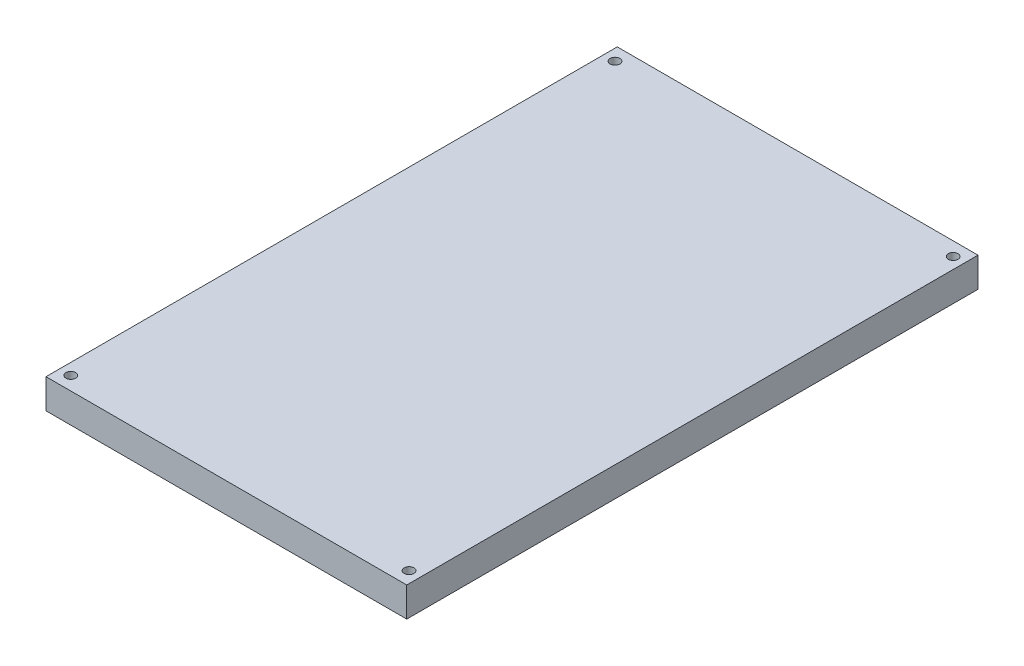
ISO-10303-21;
HEADER;
FILE_DESCRIPTION(('STEP AP214'),'2;1');
FILE_NAME('part.step','',(''),(''),'','','');
FILE_SCHEMA(('AUTOMOTIVE_DESIGN { 1 0 10303 214 1 1 1 1 }'));
ENDSEC;
DATA;
#1=APPLICATION_CONTEXT('core data for automotive mechanical design processes');
#2=APPLICATION_PROTOCOL_DEFINITION('international standard','automotive_design',2000,#1);
#3=PRODUCT_CONTEXT('',#1,'mechanical');
#4=PRODUCT('Part','Part','',(#3));
#5=PRODUCT_RELATED_PRODUCT_CATEGORY('part','',(#4));
#6=PRODUCT_DEFINITION_FORMATION('','',#4);
#7=PRODUCT_DEFINITION_CONTEXT('part definition',#1,'design');
#8=PRODUCT_DEFINITION('design','',#6,#7);
#9=PRODUCT_DEFINITION_SHAPE('','',#8);
#10=(LENGTH_UNIT() NAMED_UNIT(*) SI_UNIT(.MILLI.,.METRE.));
#11=(NAMED_UNIT(*) PLANE_ANGLE_UNIT() SI_UNIT($,.RADIAN.));
#12=(NAMED_UNIT(*) SI_UNIT($,.STERADIAN.) SOLID_ANGLE_UNIT());
#13=UNCERTAINTY_MEASURE_WITH_UNIT(LENGTH_MEASURE(1.E-05),#10,'distance_accuracy_value','');
#14=(GEOMETRIC_REPRESENTATION_CONTEXT(3) GLOBAL_UNCERTAINTY_ASSIGNED_CONTEXT((#13)) GLOBAL_UNIT_ASSIGNED_CONTEXT((#10,
#11,#12)) REPRESENTATION_CONTEXT('',''));
#15=CARTESIAN_POINT('',(0.,0.,0.));
#16=DIRECTION('',(0.,0.,1.));
#17=DIRECTION('',(1.,0.,0.));
#18=AXIS2_PLACEMENT_3D('',#15,#16,#17);
#19=CARTESIAN_POINT('',(0.,10.,0.));
#20=DIRECTION('',(0.,1.,0.));
#21=DIRECTION('',(0.,0.,1.));
#22=AXIS2_PLACEMENT_3D('',#19,#20,#21);
#23=PLANE('',#22);
#24=CARTESIAN_POINT('',(57.15,10.,-91.948));
#25=DIRECTION('',(0.,1.,0.));
#26=DIRECTION('',(0.,0.,1.));
#27=AXIS2_PLACEMENT_3D('',#24,#25,#26);
#28=CIRCLE('',#27,1.651);
#29=CARTESIAN_POINT('',(57.15,10.,-90.297));
#30=VERTEX_POINT('',#29);
#31=EDGE_CURVE('E124',#30,#30,#28,.T.);
#32=ORIENTED_EDGE('',*,*,#31,.F.);
#33=EDGE_LOOP('',(#32));
#34=FACE_BOUND('',#33,.T.);
#35=CARTESIAN_POINT('',(-57.15,10.,91.9607));
#36=DIRECTION('',(0.,1.,0.));
#37=DIRECTION('',(0.,0.,1.));
#38=AXIS2_PLACEMENT_3D('',#35,#36,#37);
#39=CIRCLE('',#38,1.651);
#40=CARTESIAN_POINT('',(-57.15,10.,93.6117));
#41=VERTEX_POINT('',#40);
#42=EDGE_CURVE('E103',#41,#41,#39,.T.);
#43=ORIENTED_EDGE('',*,*,#42,.F.);
#44=EDGE_LOOP('',(#43));
#45=FACE_BOUND('',#44,.T.);
#46=DIRECTION('',(0.,0.,1.));
#47=VECTOR('',#46,1.);
#48=CARTESIAN_POINT('',(-60.96,10.,96.5327));
#49=LINE('',#48,#47);
#50=CARTESIAN_POINT('',(-60.96,10.,-96.5327));
#51=VERTEX_POINT('',#50);
#52=CARTESIAN_POINT('',(-60.96,10.,96.5327));
#53=VERTEX_POINT('',#52);
#54=EDGE_CURVE('E88',#51,#53,#49,.T.);
#55=ORIENTED_EDGE('',*,*,#54,.T.);
#56=DIRECTION('',(1.,0.,0.));
#57=VECTOR('',#56,1.);
#58=CARTESIAN_POINT('',(60.96,10.,96.5327));
#59=LINE('',#58,#57);
#60=CARTESIAN_POINT('',(60.96,10.,96.5327));
#61=VERTEX_POINT('',#60);
#62=EDGE_CURVE('E83',#53,#61,#59,.T.);
#63=ORIENTED_EDGE('',*,*,#62,.T.);
#64=DIRECTION('',(0.,0.,-1.));
#65=VECTOR('',#64,1.);
#66=CARTESIAN_POINT('',(60.96,10.,96.5327));
#67=LINE('',#66,#65);
#68=CARTESIAN_POINT('',(60.96,10.,-96.5327));
#69=VERTEX_POINT('',#68);
#70=EDGE_CURVE('E86',#61,#69,#67,.T.);
#71=ORIENTED_EDGE('',*,*,#70,.T.);
#72=DIRECTION('',(-1.,0.,0.));
#73=VECTOR('',#72,1.);
#74=CARTESIAN_POINT('',(60.96,10.,-96.5327));
#75=LINE('',#74,#73);
#76=EDGE_CURVE('E53',#69,#51,#75,.T.);
#77=ORIENTED_EDGE('',*,*,#76,.T.);
#78=EDGE_LOOP('',(#55,#63,#71,#77));
#79=FACE_BOUND('',#78,.T.);
#80=CARTESIAN_POINT('',(57.15,10.,91.948));
#81=DIRECTION('',(0.,1.,0.));
#82=DIRECTION('',(0.,0.,-1.));
#83=AXIS2_PLACEMENT_3D('',#80,#81,#82);
#84=CIRCLE('',#83,1.651);
#85=CARTESIAN_POINT('',(57.15,10.,90.297));
#86=VERTEX_POINT('',#85);
#87=EDGE_CURVE('E118',#86,#86,#84,.T.);
#88=ORIENTED_EDGE('',*,*,#87,.F.);
#89=EDGE_LOOP('',(#88));
#90=FACE_BOUND('',#89,.T.);
#91=CARTESIAN_POINT('',(-57.15,10.,-91.948));
#92=DIRECTION('',(0.,1.,0.));
#93=DIRECTION('',(0.,0.,-1.));
#94=AXIS2_PLACEMENT_3D('',#91,#92,#93);
#95=CIRCLE('',#94,1.65099999999999);
#96=CARTESIAN_POINT('',(-57.15,10.,-93.599));
#97=VERTEX_POINT('',#96);
#98=EDGE_CURVE('E130',#97,#97,#95,.T.);
#99=ORIENTED_EDGE('',*,*,#98,.F.);
#100=EDGE_LOOP('',(#99));
#101=FACE_BOUND('',#100,.T.);
#102=ADVANCED_FACE('F36',(#34,#45,#79,#90,#101),#23,.T.);
#103=CARTESIAN_POINT('',(0.,0.,0.));
#104=DIRECTION('',(0.,1.,0.));
#105=DIRECTION('',(0.,0.,1.));
#106=AXIS2_PLACEMENT_3D('',#103,#104,#105);
#107=PLANE('',#106);
#108=DIRECTION('',(0.,0.,1.));
#109=VECTOR('',#108,1.);
#110=CARTESIAN_POINT('',(-60.96,0.,96.5327));
#111=LINE('',#110,#109);
#112=CARTESIAN_POINT('',(-60.96,0.,-96.5327));
#113=VERTEX_POINT('',#112);
#114=CARTESIAN_POINT('',(-60.96,0.,96.5327));
#115=VERTEX_POINT('',#114);
#116=EDGE_CURVE('E100',#113,#115,#111,.T.);
#117=ORIENTED_EDGE('',*,*,#116,.F.);
#118=DIRECTION('',(-1.,0.,0.));
#119=VECTOR('',#118,1.);
#120=CARTESIAN_POINT('',(60.96,0.,-96.5327));
#121=LINE('',#120,#119);
#122=CARTESIAN_POINT('',(60.96,0.,-96.5327));
#123=VERTEX_POINT('',#122);
#124=EDGE_CURVE('E76',#123,#113,#121,.T.);
#125=ORIENTED_EDGE('',*,*,#124,.F.);
#126=DIRECTION('',(0.,0.,-1.));
#127=VECTOR('',#126,1.);
#128=CARTESIAN_POINT('',(60.96,0.,96.5327));
#129=LINE('',#128,#127);
#130=CARTESIAN_POINT('',(60.96,0.,96.5327));
#131=VERTEX_POINT('',#130);
#132=EDGE_CURVE('E70',#131,#123,#129,.T.);
#133=ORIENTED_EDGE('',*,*,#132,.F.);
#134=DIRECTION('',(1.,0.,0.));
#135=VECTOR('',#134,1.);
#136=CARTESIAN_POINT('',(60.96,0.,96.5327));
#137=LINE('',#136,#135);
#138=EDGE_CURVE('E92',#115,#131,#137,.T.);
#139=ORIENTED_EDGE('',*,*,#138,.F.);
#140=EDGE_LOOP('',(#117,#125,#133,#139));
#141=FACE_BOUND('',#140,.T.);
#142=CARTESIAN_POINT('',(-57.15,0.,91.9607));
#143=DIRECTION('',(0.,1.,0.));
#144=DIRECTION('',(0.,0.,1.));
#145=AXIS2_PLACEMENT_3D('',#142,#143,#144);
#146=CIRCLE('',#145,1.651);
#147=CARTESIAN_POINT('',(-57.15,0.,93.6117));
#148=VERTEX_POINT('',#147);
#149=EDGE_CURVE('E115',#148,#148,#146,.T.);
#150=ORIENTED_EDGE('',*,*,#149,.T.);
#151=EDGE_LOOP('',(#150));
#152=FACE_BOUND('',#151,.T.);
#153=CARTESIAN_POINT('',(57.15,0.,91.948));
#154=DIRECTION('',(0.,1.,0.));
#155=DIRECTION('',(0.,0.,-1.));
#156=AXIS2_PLACEMENT_3D('',#153,#154,#155);
#157=CIRCLE('',#156,1.651);
#158=CARTESIAN_POINT('',(57.15,0.,90.297));
#159=VERTEX_POINT('',#158);
#160=EDGE_CURVE('E121',#159,#159,#157,.T.);
#161=ORIENTED_EDGE('',*,*,#160,.T.);
#162=EDGE_LOOP('',(#161));
#163=FACE_BOUND('',#162,.T.);
#164=CARTESIAN_POINT('',(57.15,0.,-91.948));
#165=DIRECTION('',(0.,1.,0.));
#166=DIRECTION('',(0.,0.,1.));
#167=AXIS2_PLACEMENT_3D('',#164,#165,#166);
#168=CIRCLE('',#167,1.651);
#169=CARTESIAN_POINT('',(57.15,0.,-90.297));
#170=VERTEX_POINT('',#169);
#171=EDGE_CURVE('E127',#170,#170,#168,.T.);
#172=ORIENTED_EDGE('',*,*,#171,.T.);
#173=EDGE_LOOP('',(#172));
#174=FACE_BOUND('',#173,.T.);
#175=CARTESIAN_POINT('',(-57.15,0.,-91.948));
#176=DIRECTION('',(0.,1.,0.));
#177=DIRECTION('',(0.,0.,-1.));
#178=AXIS2_PLACEMENT_3D('',#175,#176,#177);
#179=CIRCLE('',#178,1.65099999999999);
#180=CARTESIAN_POINT('',(-57.15,0.,-93.599));
#181=VERTEX_POINT('',#180);
#182=EDGE_CURVE('E133',#181,#181,#179,.T.);
#183=ORIENTED_EDGE('',*,*,#182,.T.);
#184=EDGE_LOOP('',(#183));
#185=FACE_BOUND('',#184,.T.);
#186=ADVANCED_FACE('F111',(#141,#152,#163,#174,#185),#107,.F.);
#187=CARTESIAN_POINT('',(-60.96,10.,96.5327));
#188=DIRECTION('',(1.,0.,0.));
#189=DIRECTION('',(0.,0.,-1.));
#190=AXIS2_PLACEMENT_3D('',#187,#188,#189);
#191=PLANE('',#190);
#192=ORIENTED_EDGE('',*,*,#116,.T.);
#193=DIRECTION('',(0.,-1.,0.));
#194=VECTOR('',#193,1.);
#195=CARTESIAN_POINT('',(-60.96,10.,96.5327));
#196=LINE('',#195,#194);
#197=EDGE_CURVE('E11',#53,#115,#196,.T.);
#198=ORIENTED_EDGE('',*,*,#197,.F.);
#199=ORIENTED_EDGE('',*,*,#54,.F.);
#200=DIRECTION('',(0.,-1.,0.));
#201=VECTOR('',#200,1.);
#202=CARTESIAN_POINT('',(-60.96,10.,-96.5327));
#203=LINE('',#202,#201);
#204=EDGE_CURVE('E96',#51,#113,#203,.T.);
#205=ORIENTED_EDGE('',*,*,#204,.T.);
#206=EDGE_LOOP('',(#192,#198,#199,#205));
#207=FACE_BOUND('',#206,.T.);
#208=ADVANCED_FACE('F38',(#207),#191,.F.);
#209=CARTESIAN_POINT('',(60.96,10.,96.5327));
#210=DIRECTION('',(0.,0.,-1.));
#211=DIRECTION('',(-1.,0.,0.));
#212=AXIS2_PLACEMENT_3D('',#209,#210,#211);
#213=PLANE('',#212);
#214=ORIENTED_EDGE('',*,*,#138,.T.);
#215=DIRECTION('',(0.,-1.,0.));
#216=VECTOR('',#215,1.);
#217=CARTESIAN_POINT('',(60.96,10.,96.5327));
#218=LINE('',#217,#216);
#219=EDGE_CURVE('E45',#61,#131,#218,.T.);
#220=ORIENTED_EDGE('',*,*,#219,.F.);
#221=ORIENTED_EDGE('',*,*,#62,.F.);
#222=ORIENTED_EDGE('',*,*,#197,.T.);
#223=EDGE_LOOP('',(#214,#220,#221,#222));
#224=FACE_BOUND('',#223,.T.);
#225=ADVANCED_FACE('F91',(#224),#213,.F.);
#226=CARTESIAN_POINT('',(60.96,10.,96.5327));
#227=DIRECTION('',(-1.,0.,0.));
#228=DIRECTION('',(0.,0.,1.));
#229=AXIS2_PLACEMENT_3D('',#226,#227,#228);
#230=PLANE('',#229);
#231=ORIENTED_EDGE('',*,*,#132,.T.);
#232=DIRECTION('',(0.,-1.,0.));
#233=VECTOR('',#232,1.);
#234=CARTESIAN_POINT('',(60.96,10.,-96.5327));
#235=LINE('',#234,#233);
#236=EDGE_CURVE('E93',#69,#123,#235,.T.);
#237=ORIENTED_EDGE('',*,*,#236,.F.);
#238=ORIENTED_EDGE('',*,*,#70,.F.);
#239=ORIENTED_EDGE('',*,*,#219,.T.);
#240=EDGE_LOOP('',(#231,#237,#238,#239));
#241=FACE_BOUND('',#240,.T.);
#242=ADVANCED_FACE('F94',(#241),#230,.F.);
#243=CARTESIAN_POINT('',(60.96,10.,-96.5327));
#244=DIRECTION('',(0.,0.,1.));
#245=DIRECTION('',(1.,0.,0.));
#246=AXIS2_PLACEMENT_3D('',#243,#244,#245);
#247=PLANE('',#246);
#248=ORIENTED_EDGE('',*,*,#124,.T.);
#249=ORIENTED_EDGE('',*,*,#204,.F.);
#250=ORIENTED_EDGE('',*,*,#76,.F.);
#251=ORIENTED_EDGE('',*,*,#236,.T.);
#252=EDGE_LOOP('',(#248,#249,#250,#251));
#253=FACE_BOUND('',#252,.T.);
#254=ADVANCED_FACE('F108',(#253),#247,.F.);
#255=CARTESIAN_POINT('',(-57.15,10.,91.9607));
#256=DIRECTION('',(0.,-1.,0.));
#257=DIRECTION('',(0.,0.,-1.));
#258=AXIS2_PLACEMENT_3D('',#255,#256,#257);
#259=CYLINDRICAL_SURFACE('',#258,1.651);
#260=ORIENTED_EDGE('',*,*,#42,.T.);
#261=EDGE_LOOP('',(#260));
#262=FACE_BOUND('',#261,.T.);
#263=ORIENTED_EDGE('',*,*,#149,.F.);
#264=EDGE_LOOP('',(#263));
#265=FACE_BOUND('',#264,.T.);
#266=ADVANCED_FACE('F152',(#262,#265),#259,.F.);
#267=CARTESIAN_POINT('',(57.15,10.,91.948));
#268=DIRECTION('',(0.,-1.,0.));
#269=DIRECTION('',(0.,0.,-1.));
#270=AXIS2_PLACEMENT_3D('',#267,#268,#269);
#271=CYLINDRICAL_SURFACE('',#270,1.651);
#272=ORIENTED_EDGE('',*,*,#87,.T.);
#273=EDGE_LOOP('',(#272));
#274=FACE_BOUND('',#273,.T.);
#275=ORIENTED_EDGE('',*,*,#160,.F.);
#276=EDGE_LOOP('',(#275));
#277=FACE_BOUND('',#276,.T.);
#278=ADVANCED_FACE('F198',(#274,#277),#271,.F.);
#279=CARTESIAN_POINT('',(57.15,10.,-91.948));
#280=DIRECTION('',(0.,-1.,0.));
#281=DIRECTION('',(0.,0.,-1.));
#282=AXIS2_PLACEMENT_3D('',#279,#280,#281);
#283=CYLINDRICAL_SURFACE('',#282,1.651);
#284=ORIENTED_EDGE('',*,*,#31,.T.);
#285=EDGE_LOOP('',(#284));
#286=FACE_BOUND('',#285,.T.);
#287=ORIENTED_EDGE('',*,*,#171,.F.);
#288=EDGE_LOOP('',(#287));
#289=FACE_BOUND('',#288,.T.);
#290=ADVANCED_FACE('F206',(#286,#289),#283,.F.);
#291=CARTESIAN_POINT('',(-57.15,10.,-91.948));
#292=DIRECTION('',(0.,-1.,0.));
#293=DIRECTION('',(0.,0.,-1.));
#294=AXIS2_PLACEMENT_3D('',#291,#292,#293);
#295=CYLINDRICAL_SURFACE('',#294,1.65099999999999);
#296=ORIENTED_EDGE('',*,*,#98,.T.);
#297=EDGE_LOOP('',(#296));
#298=FACE_BOUND('',#297,.T.);
#299=ORIENTED_EDGE('',*,*,#182,.F.);
#300=EDGE_LOOP('',(#299));
#301=FACE_BOUND('',#300,.T.);
#302=ADVANCED_FACE('F139',(#298,#301),#295,.F.);
#303=CLOSED_SHELL('',(#102,#186,#208,#225,#242,#254,#266,#278,#290,#302));
#304=MANIFOLD_SOLID_BREP('B2',#303);
#305=ADVANCED_BREP_SHAPE_REPRESENTATION('',(#18,#304),#14);
#306=SHAPE_DEFINITION_REPRESENTATION(#9,#305);
ENDSEC;
END-ISO-10303-21;
